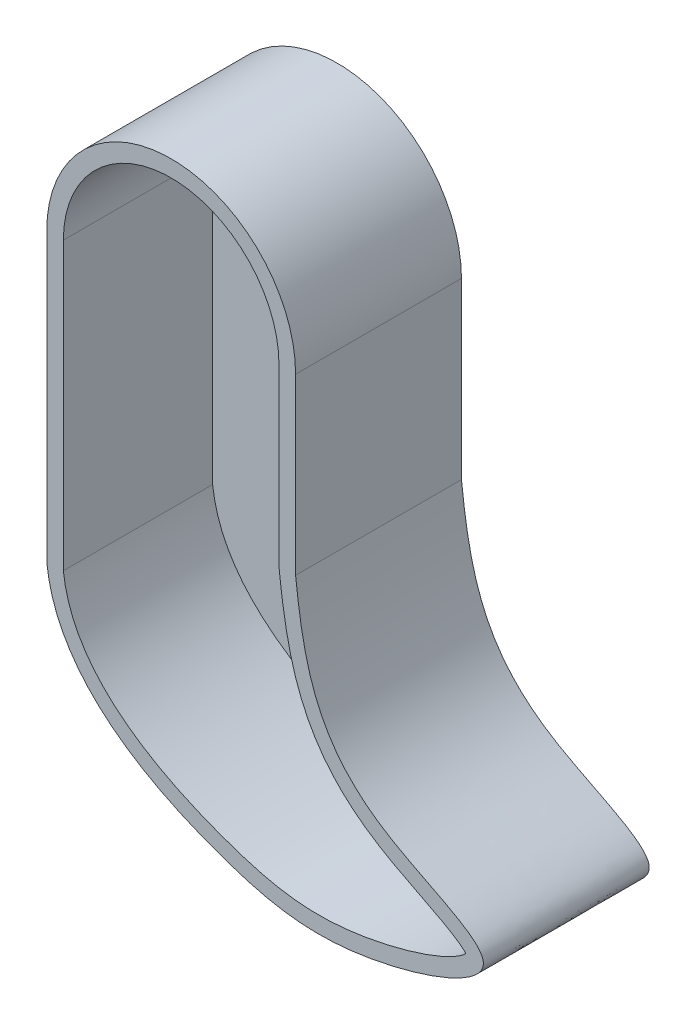
ISO-10303-21;
HEADER;
FILE_DESCRIPTION(('STEP AP214'),'2;1');
FILE_NAME('part.step','',(''),(''),'','','');
FILE_SCHEMA(('AUTOMOTIVE_DESIGN { 1 0 10303 214 1 1 1 1 }'));
ENDSEC;
DATA;
#1=APPLICATION_CONTEXT('core data for automotive mechanical design processes');
#2=APPLICATION_PROTOCOL_DEFINITION('international standard','automotive_design',2000,#1);
#3=PRODUCT_CONTEXT('',#1,'mechanical');
#4=PRODUCT('Part','Part','',(#3));
#5=PRODUCT_RELATED_PRODUCT_CATEGORY('part','',(#4));
#6=PRODUCT_DEFINITION_FORMATION('','',#4);
#7=PRODUCT_DEFINITION_CONTEXT('part definition',#1,'design');
#8=PRODUCT_DEFINITION('design','',#6,#7);
#9=PRODUCT_DEFINITION_SHAPE('','',#8);
#10=(LENGTH_UNIT() NAMED_UNIT(*) SI_UNIT(.MILLI.,.METRE.));
#11=(NAMED_UNIT(*) PLANE_ANGLE_UNIT() SI_UNIT($,.RADIAN.));
#12=(NAMED_UNIT(*) SI_UNIT($,.STERADIAN.) SOLID_ANGLE_UNIT());
#13=UNCERTAINTY_MEASURE_WITH_UNIT(LENGTH_MEASURE(1.E-05),#10,'distance_accuracy_value','');
#14=(GEOMETRIC_REPRESENTATION_CONTEXT(3) GLOBAL_UNCERTAINTY_ASSIGNED_CONTEXT((#13)) GLOBAL_UNIT_ASSIGNED_CONTEXT((#10,
#11,#12)) REPRESENTATION_CONTEXT('',''));
#15=CARTESIAN_POINT('',(0.,0.,0.));
#16=DIRECTION('',(0.,0.,1.));
#17=DIRECTION('',(1.,0.,0.));
#18=AXIS2_PLACEMENT_3D('',#15,#16,#17);
#19=CARTESIAN_POINT('',(13.921361338976,-27.838430990596,10.));
#20=DIRECTION('',(0.,0.,-1.));
#21=DIRECTION('',(-1.,0.,0.));
#22=AXIS2_PLACEMENT_3D('',#19,#20,#21);
#23=PLANE('',#22);
#24=CARTESIAN_POINT('',(-7.5,-17.3169089590409,10.));
#25=CARTESIAN_POINT('',(-6.89625884792365,-22.8795869577521,10.));
#26=CARTESIAN_POINT('',(1.36358622441409,-27.3729409812053,10.));
#27=CARTESIAN_POINT('',(10.3404825219533,-29.3226567150593,10.));
#28=CARTESIAN_POINT('',(22.6747988148398,-25.2262217653623,10.));
#29=CARTESIAN_POINT('',(9.30587516399608,-20.560899137592,10.));
#30=CARTESIAN_POINT('',(8.02129707642926,-15.2016571727447,10.));
#31=CARTESIAN_POINT('',(7.5,-10.5047296805398,10.));
#32=B_SPLINE_CURVE_WITH_KNOTS('',3,(#24,#25,#26,#27,#28,#29,#30,#31),.UNSPECIFIED.,.F.,.F.,(4,1,
1,1,1,4),(0.,0.302367305595142,0.458332467384121,0.620571953409648,0.756191840725524,1.),.UNSPECIFIED.);
#33=CARTESIAN_POINT('',(-7.5,-17.3169089590409,10.));
#34=VERTEX_POINT('',#33);
#35=CARTESIAN_POINT('',(7.5,-10.5047296805398,10.));
#36=VERTEX_POINT('',#35);
#37=EDGE_CURVE('E230',#34,#36,#32,.T.);
#38=ORIENTED_EDGE('',*,*,#37,.T.);
#39=DIRECTION('',(0.,1.,0.));
#40=VECTOR('',#39,1.);
#41=CARTESIAN_POINT('',(7.5,0.,10.));
#42=LINE('',#41,#40);
#43=CARTESIAN_POINT('',(7.5,0.,10.));
#44=VERTEX_POINT('',#43);
#45=EDGE_CURVE('E89',#36,#44,#42,.T.);
#46=ORIENTED_EDGE('',*,*,#45,.T.);
#47=CARTESIAN_POINT('',(0.,0.,10.));
#48=DIRECTION('',(0.,0.,1.));
#49=DIRECTION('',(1.,0.,0.));
#50=AXIS2_PLACEMENT_3D('',#47,#48,#49);
#51=CIRCLE('',#50,7.5);
#52=CARTESIAN_POINT('',(-7.5,0.,10.));
#53=VERTEX_POINT('',#52);
#54=EDGE_CURVE('E226',#44,#53,#51,.T.);
#55=ORIENTED_EDGE('',*,*,#54,.T.);
#56=DIRECTION('',(0.,-1.,0.));
#57=VECTOR('',#56,1.);
#58=CARTESIAN_POINT('',(-7.5,0.,10.));
#59=LINE('',#58,#57);
#60=EDGE_CURVE('E61',#53,#34,#59,.T.);
#61=ORIENTED_EDGE('',*,*,#60,.T.);
#62=EDGE_LOOP('',(#38,#46,#55,#61));
#63=FACE_BOUND('',#62,.T.);
#64=CARTESIAN_POINT('',(-6.49999999999993,-17.261239945099,9.99999999999999));
#65=CARTESIAN_POINT('',(-6.48029906016181,-17.4328165468344,10.));
#66=CARTESIAN_POINT('',(-6.45509323324352,-17.6037808591576,10.));
#67=CARTESIAN_POINT('',(-6.39355463378053,-17.9436223656716,10.));
#68=CARTESIAN_POINT('',(-6.35722625396409,-18.1125003564876,10.));
#69=CARTESIAN_POINT('',(-6.27331995548039,-18.4474037011993,10.));
#70=CARTESIAN_POINT('',(-6.22574469781171,-18.6134297199166,10.));
#71=CARTESIAN_POINT('',(-6.12013460749391,-18.9398851210933,10.));
#72=CARTESIAN_POINT('',(-6.06223422575287,-19.1003580396069,10.));
#73=CARTESIAN_POINT('',(-5.93592880304156,-19.4171121801897,10.));
#74=CARTESIAN_POINT('',(-5.86752391746992,-19.5733934642278,10.));
#75=CARTESIAN_POINT('',(-5.72074424757256,-19.8811661946707,10.));
#76=CARTESIAN_POINT('',(-5.6423702788494,-20.0326580316511,10.));
#77=CARTESIAN_POINT('',(-5.43500746583914,-20.4044361187385,10.));
#78=CARTESIAN_POINT('',(-5.30021693932986,-20.621508827345,10.));
#79=CARTESIAN_POINT('',(-5.01226569773036,-21.0430348770489,10.));
#80=CARTESIAN_POINT('',(-4.85910295241641,-21.2474868196993,10.));
#81=CARTESIAN_POINT('',(-4.53680312190699,-21.6438328646214,10.));
#82=CARTESIAN_POINT('',(-4.36764281904924,-21.8357080088182,10.));
#83=CARTESIAN_POINT('',(-4.01603093713922,-22.2067951451904,10.));
#84=CARTESIAN_POINT('',(-3.83357855950455,-22.3860063752468,10.));
#85=CARTESIAN_POINT('',(-3.33789964982451,-22.8425598375109,10.));
#86=CARTESIAN_POINT('',(-3.01533202203772,-23.1097847080785,10.));
#87=CARTESIAN_POINT('',(-2.34815144859963,-23.6151887548566,10.));
#88=CARTESIAN_POINT('',(-2.00352181788423,-23.8533455421908,10.));
#89=CARTESIAN_POINT('',(-1.2956404040035,-24.3054911038546,10.));
#90=CARTESIAN_POINT('',(-0.932279679330191,-24.5193079575086,10.));
#91=CARTESIAN_POINT('',(-0.1931361983791,-24.9242762146099,10.));
#92=CARTESIAN_POINT('',(0.182649137410054,-25.1154228731613,9.99999999999999));
#93=CARTESIAN_POINT('',(0.812572312512014,-25.4154727327877,9.99999999999999));
#94=CARTESIAN_POINT('',(1.0640478406448,-25.5300337102047,10.));
#95=CARTESIAN_POINT('',(1.57044344627079,-25.7513613484301,10.));
#96=CARTESIAN_POINT('',(1.82536395351148,-25.8581270259684,10.));
#97=CARTESIAN_POINT('',(2.33825409101171,-26.0645619215595,10.));
#98=CARTESIAN_POINT('',(2.59622567150063,-26.1642262788482,10.));
#99=CARTESIAN_POINT('',(3.11486458162769,-26.3570747331266,10.));
#100=CARTESIAN_POINT('',(3.37553435177269,-26.4502522418269,10.));
#101=CARTESIAN_POINT('',(3.89678670150565,-26.629768500074,10.));
#102=CARTESIAN_POINT('',(4.15735171494059,-26.7161580045258,10.));
#103=CARTESIAN_POINT('',(4.68116014836606,-26.8799427220831,10.));
#104=CARTESIAN_POINT('',(4.94440183629279,-26.9573433933567,10.));
#105=CARTESIAN_POINT('',(5.47379131233374,-27.1001119481251,10.));
#106=CARTESIAN_POINT('',(5.73993476563539,-27.1654957115978,10.));
#107=CARTESIAN_POINT('',(6.27524416947605,-27.2816449185962,10.));
#108=CARTESIAN_POINT('',(6.54440773753797,-27.3324211442526,9.99999999999999));
#109=CARTESIAN_POINT('',(6.97071358182693,-27.3995689623728,10.));
#110=CARTESIAN_POINT('',(7.1270091833725,-27.4214031515299,10.));
#111=CARTESIAN_POINT('',(7.44028704548098,-27.4594791317654,10.));
#112=CARTESIAN_POINT('',(7.59726931480795,-27.4757208512541,10.));
#113=CARTESIAN_POINT('',(7.91187884802593,-27.5025699601194,10.));
#114=CARTESIAN_POINT('',(8.06950661195826,-27.5131714893043,10.));
#115=CARTESIAN_POINT('',(8.38504206045178,-27.5287914062703,10.));
#116=CARTESIAN_POINT('',(8.54294976216256,-27.5338094392597,10.));
#117=CARTESIAN_POINT('',(9.01681640956228,-27.5407237637606,10.));
#118=CARTESIAN_POINT('',(9.33291986202077,-27.5344803612462,10.));
#119=CARTESIAN_POINT('',(9.96474927181373,-27.5024279032612,10.));
#120=CARTESIAN_POINT('',(10.2804729474075,-27.4765767100368,10.));
#121=CARTESIAN_POINT('',(10.7525955002393,-27.425104892758,10.));
#122=CARTESIAN_POINT('',(10.9097210604433,-27.4058325682766,10.));
#123=CARTESIAN_POINT('',(11.2234481057773,-27.363388017639,10.));
#124=CARTESIAN_POINT('',(11.3800495864079,-27.3402157580862,10.));
#125=CARTESIAN_POINT('',(11.6926798783897,-27.2903839648362,10.));
#126=CARTESIAN_POINT('',(11.8487087356949,-27.2637247175566,10.));
#127=CARTESIAN_POINT('',(12.1601744067584,-27.2071663238503,10.));
#128=CARTESIAN_POINT('',(12.3156112255831,-27.1772672052133,10.));
#129=CARTESIAN_POINT('',(12.7265477001599,-27.0939736197893,10.));
#130=CARTESIAN_POINT('',(12.9815135004647,-27.0379248873304,10.));
#131=CARTESIAN_POINT('',(13.4894426852966,-26.9176125746787,10.));
#132=CARTESIAN_POINT('',(13.7424064702328,-26.8533506836141,10.));
#133=CARTESIAN_POINT('',(14.2464145360765,-26.7160641566162,10.));
#134=CARTESIAN_POINT('',(14.4974548116646,-26.6430247756349,10.));
#135=CARTESIAN_POINT('',(14.996507755685,-26.4872153794536,10.));
#136=CARTESIAN_POINT('',(15.2445207375963,-26.4044463813638,10.));
#137=CARTESIAN_POINT('',(15.632509641243,-26.2644525437871,10.));
#138=CARTESIAN_POINT('',(15.7739155900815,-26.2111854834667,10.));
#139=CARTESIAN_POINT('',(16.0548690037753,-26.0999729344172,10.));
#140=CARTESIAN_POINT('',(16.1944167543763,-26.0420281749131,10.));
#141=CARTESIAN_POINT('',(16.4243011138092,-25.9409252224867,10.));
#142=CARTESIAN_POINT('',(16.515345969151,-25.8993796199356,10.));
#143=CARTESIAN_POINT('',(16.6960081145704,-25.8132947594487,10.));
#144=CARTESIAN_POINT('',(16.7856254969678,-25.7687556960909,10.));
#145=CARTESIAN_POINT('',(16.9629814464259,-25.6760081265155,10.));
#146=CARTESIAN_POINT('',(17.0507197831614,-25.6277991737201,10.));
#147=CARTESIAN_POINT('',(17.1746030470854,-25.5552407521348,10.));
#148=CARTESIAN_POINT('',(17.2118741103908,-25.5328103949705,10.));
#149=CARTESIAN_POINT('',(17.2857603620924,-25.486927613043,10.));
#150=CARTESIAN_POINT('',(17.3223758530832,-25.4634756779203,10.));
#151=CARTESIAN_POINT('',(17.3947735465507,-25.4153956751291,10.));
#152=CARTESIAN_POINT('',(17.4305565777302,-25.3907688587321,10.));
#153=CARTESIAN_POINT('',(17.5013553411414,-25.3398954622947,10.));
#154=CARTESIAN_POINT('',(17.5363636803619,-25.3136384833334,10.));
#155=CARTESIAN_POINT('',(17.5878101164617,-25.2728748754743,10.));
#156=CARTESIAN_POINT('',(17.6047890691941,-25.2590504145316,10.));
#157=CARTESIAN_POINT('',(17.638300369847,-25.2308766124184,10.));
#158=CARTESIAN_POINT('',(17.654832818426,-25.2165273912947,10.));
#159=CARTESIAN_POINT('',(17.6874255292288,-25.1871486071416,10.));
#160=CARTESIAN_POINT('',(17.7034832737142,-25.1721162218114,10.));
#161=CARTESIAN_POINT('',(17.734845672944,-25.1412646107769,10.));
#162=CARTESIAN_POINT('',(17.7501497329763,-25.125444782904,10.));
#163=CARTESIAN_POINT('',(17.7649636355238,-25.1091586426348,10.));
#164=B_SPLINE_CURVE_WITH_KNOTS('',3,(#64,#65,#66,#67,#68,#69,#70,#71,#72,#73,#74,#75,#76,#77,
#78,#79,#80,#81,#82,#83,#84,#85,#86,#87,#88,#89,#90,#91,#92,#93,#94,#95,#96,#97,#98,#99,#100,
#101,#102,#103,#104,#105,#106,#107,#108,#109,#110,#111,#112,#113,#114,#115,#116,#117,#118,#119,
#120,#121,#122,#123,#124,#125,#126,#127,#128,#129,#130,#131,#132,#133,#134,#135,#136,#137,#138,
#139,#140,#141,#142,#143,#144,#145,#146,#147,#148,#149,#150,#151,#152,#153,#154,#155,#156,#157,
#158,#159,#160,#161,#162,#163),.UNSPECIFIED.,.F.,.F.,(4,2,2,2,2,2,2,2,2,2,2,2,2,2,2,2,2,2,2,2,2,
2,2,2,2,2,2,2,2,2,2,2,2,2,2,2,2,2,2,2,2,2,2,2,2,2,2,2,2,4),(0.,0.518053182814718,
1.0359020296474,1.55362847643608,2.06504922092012,2.57646240041711,3.08783376644617,
3.85325986621461,4.61877062752203,5.385409961692,6.15209539328386,7.40661975249448,
8.66210435665975,9.92596876800315,11.1900972424152,12.0189953660128,12.8479978637752,
13.6775624579954,14.5079576556418,15.3313958035025,16.1543313024597,16.9761713728533,
17.7974032601956,18.2707542308085,18.7441112606013,19.2179591554148,19.6918371581948,
20.639590266651,21.5893859172373,22.0642546107012,22.5391273708247,23.0139611498217,
23.4887908562769,24.2718060199006,25.0546604060172,25.8388487689217,26.6229552275033,
27.0762115891065,27.5293974267347,27.8295811501585,28.1297453801688,28.4299461948366,
28.560433421239,28.6908587790743,28.8211482040758,28.9523770805086,29.0180540067527,
29.0837160012647,29.149679604839,29.2156944508237),.UNSPECIFIED.);
#165=CARTESIAN_POINT('',(-6.49999999999993,-17.261239945099,9.99999999999999));
#166=VERTEX_POINT('',#165);
#167=CARTESIAN_POINT('',(17.7649636355238,-25.1091586426349,10.));
#168=VERTEX_POINT('',#167);
#169=EDGE_CURVE('E164',#166,#168,#164,.T.);
#170=ORIENTED_EDGE('',*,*,#169,.F.);
#171=DIRECTION('',(0.,-1.,0.));
#172=VECTOR('',#171,1.);
#173=CARTESIAN_POINT('',(-6.5,-27.838430990596,10.));
#174=LINE('',#173,#172);
#175=CARTESIAN_POINT('',(-6.5,0.,10.));
#176=VERTEX_POINT('',#175);
#177=EDGE_CURVE('E130',#176,#166,#174,.T.);
#178=ORIENTED_EDGE('',*,*,#177,.F.);
#179=CARTESIAN_POINT('',(0.,0.,10.));
#180=DIRECTION('',(0.,0.,-1.));
#181=DIRECTION('',(-1.,0.,0.));
#182=AXIS2_PLACEMENT_3D('',#179,#180,#181);
#183=CIRCLE('',#182,6.5);
#184=CARTESIAN_POINT('',(6.5,0.,10.));
#185=VERTEX_POINT('',#184);
#186=EDGE_CURVE('E279',#185,#176,#183,.F.);
#187=ORIENTED_EDGE('',*,*,#186,.F.);
#188=DIRECTION('',(0.,1.,0.));
#189=VECTOR('',#188,1.);
#190=CARTESIAN_POINT('',(6.5,-27.838430990596,10.));
#191=LINE('',#190,#189);
#192=CARTESIAN_POINT('',(6.5,-10.5600532452522,10.));
#193=VERTEX_POINT('',#192);
#194=EDGE_CURVE('E170',#193,#185,#191,.T.);
#195=ORIENTED_EDGE('',*,*,#194,.F.);
#196=CARTESIAN_POINT('',(17.7649636355238,-25.1091586426349,10.));
#197=CARTESIAN_POINT('',(17.7505571625753,-25.0932423332572,10.));
#198=CARTESIAN_POINT('',(17.7357350873014,-25.0777172368619,10.));
#199=CARTESIAN_POINT('',(17.7054486632689,-25.0473227262312,10.));
#200=CARTESIAN_POINT('',(17.6899847000054,-25.0324529292008,10.));
#201=CARTESIAN_POINT('',(17.6586106157325,-25.0032467132118,10.));
#202=CARTESIAN_POINT('',(17.6427012340435,-24.9889094927786,10.));
#203=CARTESIAN_POINT('',(17.6105009424539,-24.9606653835675,10.));
#204=CARTESIAN_POINT('',(17.5942099667619,-24.9467585699708,10.));
#205=CARTESIAN_POINT('',(17.5449855412641,-24.9056833929883,10.));
#206=CARTESIAN_POINT('',(17.5115944952163,-24.8790633871287,10.));
#207=CARTESIAN_POINT('',(17.4439260774812,-24.8269515424653,10.));
#208=CARTESIAN_POINT('',(17.4096482913261,-24.8014602468925,10.));
#209=CARTESIAN_POINT('',(17.3408762372526,-24.7517260688844,10.));
#210=CARTESIAN_POINT('',(17.3063905610546,-24.7274712733044,10.));
#211=CARTESIAN_POINT('',(17.2369126422226,-24.6797146428677,10.));
#212=CARTESIAN_POINT('',(17.2019204903128,-24.6562126755231,10.));
#213=CARTESIAN_POINT('',(17.0962563386349,-24.5866036223037,10.));
#214=CARTESIAN_POINT('',(17.0249626364255,-24.5414403175776,10.));
#215=CARTESIAN_POINT('',(16.8814165835917,-24.4530756764949,10.));
#216=CARTESIAN_POINT('',(16.8091669558068,-24.4098698762294,10.));
#217=CARTESIAN_POINT('',(16.6638729542519,-24.3248780452416,10.));
#218=CARTESIAN_POINT('',(16.5908288619411,-24.2830915320268,10.));
#219=CARTESIAN_POINT('',(16.4441510353493,-24.2006056135248,10.));
#220=CARTESIAN_POINT('',(16.3705174235692,-24.1599059896333,10.));
#221=CARTESIAN_POINT('',(16.2227911573293,-24.0793335427676,10.));
#222=CARTESIAN_POINT('',(16.1486984598887,-24.0394607987748,10.));
#223=CARTESIAN_POINT('',(15.9259270474417,-23.9207828299126,10.));
#224=CARTESIAN_POINT('',(15.7767499768321,-23.842915075834,10.));
#225=CARTESIAN_POINT('',(15.4718789072206,-23.6854215506577,10.));
#226=CARTESIAN_POINT('',(15.3161588480723,-23.6058466643147,10.));
#227=CARTESIAN_POINT('',(15.0044580782047,-23.4469874191277,10.));
#228=CARTESIAN_POINT('',(14.8484772690663,-23.3677032537844,10.));
#229=CARTESIAN_POINT('',(14.5367292262241,-23.2085549746796,10.));
#230=CARTESIAN_POINT('',(14.3809621075205,-23.1286906346406,10.));
#231=CARTESIAN_POINT('',(14.0700862527273,-22.9675686687204,10.));
#232=CARTESIAN_POINT('',(13.9149777358256,-22.886310618382,10.));
#233=CARTESIAN_POINT('',(13.6058699220181,-22.7215693342841,10.));
#234=CARTESIAN_POINT('',(13.4518710334286,-22.638085329727,10.));
#235=CARTESIAN_POINT('',(13.2045474998594,-22.5007617041083,10.));
#236=CARTESIAN_POINT('',(13.1106896503221,-22.4478833485505,10.));
#237=CARTESIAN_POINT('',(12.9237756639142,-22.3407257434688,10.));
#238=CARTESIAN_POINT('',(12.8307195248488,-22.2864464977814,10.));
#239=CARTESIAN_POINT('',(12.645595128581,-22.176234808131,10.));
#240=CARTESIAN_POINT('',(12.5535268222113,-22.1203024469735,10.));
#241=CARTESIAN_POINT('',(12.3705880926179,-22.0065102884524,10.));
#242=CARTESIAN_POINT('',(12.2797176642472,-21.9486504993747,10.));
#243=CARTESIAN_POINT('',(12.0992993753896,-21.8309675631804,10.));
#244=CARTESIAN_POINT('',(12.0097510782925,-21.7711450862314,10.));
#245=CARTESIAN_POINT('',(11.8320533220089,-21.6494593967372,10.));
#246=CARTESIAN_POINT('',(11.743903874323,-21.5875961674268,10.));
#247=CARTESIAN_POINT('',(11.4816869223924,-21.3988405591983,10.));
#248=CARTESIAN_POINT('',(11.3098684802247,-21.2687937364546,10.));
#249=CARTESIAN_POINT('',(10.9769188210014,-21.0029277720903,10.));
#250=CARTESIAN_POINT('',(10.8156354450643,-20.8672993026084,10.));
#251=CARTESIAN_POINT('',(10.5005820813295,-20.5874281364921,10.));
#252=CARTESIAN_POINT('',(10.3468152913358,-20.4431818305492,10.));
#253=CARTESIAN_POINT('',(10.0478140502741,-20.1461379023526,10.));
#254=CARTESIAN_POINT('',(9.90257807873936,-19.9933418134832,10.));
#255=CARTESIAN_POINT('',(9.62150621538568,-19.6794226865007,10.));
#256=CARTESIAN_POINT('',(9.48566722168205,-19.5183024271193,10.));
#257=CARTESIAN_POINT('',(9.20342238093093,-19.1620518328644,10.));
#258=CARTESIAN_POINT('',(9.05872500782777,-18.9655633107356,10.));
#259=CARTESIAN_POINT('',(8.78357290760833,-18.562865609258,10.));
#260=CARTESIAN_POINT('',(8.65311826090011,-18.3566563750398,10.));
#261=CARTESIAN_POINT('',(8.40674627185208,-17.9357933836112,10.));
#262=CARTESIAN_POINT('',(8.2908264049602,-17.7211411014097,10.));
#263=CARTESIAN_POINT('',(8.07117158469306,-17.2805470241438,10.));
#264=CARTESIAN_POINT('',(7.96771380019996,-17.0544675110704,10.));
#265=CARTESIAN_POINT('',(7.77486005168547,-16.5963816948951,10.));
#266=CARTESIAN_POINT('',(7.68546615160262,-16.3643745276797,10.));
#267=CARTESIAN_POINT('',(7.51959853235106,-15.8958340095877,10.));
#268=CARTESIAN_POINT('',(7.44312414929945,-15.6593008919776,10.));
#269=CARTESIAN_POINT('',(7.2928242257589,-15.1530991609168,10.));
#270=CARTESIAN_POINT('',(7.22052201586254,-14.8829812335082,10.));
#271=CARTESIAN_POINT('',(7.08821588698118,-14.3397570932647,10.));
#272=CARTESIAN_POINT('',(7.02821351173458,-14.0666505098526,10.));
#273=CARTESIAN_POINT('',(6.91823677554613,-13.5182752526109,10.));
#274=CARTESIAN_POINT('',(6.8682687191229,-13.2430053317119,10.));
#275=CARTESIAN_POINT('',(6.77784655500824,-12.7005515313273,10.));
#276=CARTESIAN_POINT('',(6.73712653493331,-12.4334112886218,10.));
#277=CARTESIAN_POINT('',(6.66137038959387,-11.8985479604055,10.));
#278=CARTESIAN_POINT('',(6.62632996168699,-11.6308254732819,10.));
#279=CARTESIAN_POINT('',(6.56043645469034,-11.0954581898135,10.));
#280=CARTESIAN_POINT('',(6.52957435433921,-10.82781451252,10.));
#281=CARTESIAN_POINT('',(6.5,-10.5600532452522,10.));
#282=B_SPLINE_CURVE_WITH_KNOTS('',3,(#196,#197,#198,#199,#200,#201,#202,#203,#204,#205,#206,
#207,#208,#209,#210,#211,#212,#213,#214,#215,#216,#217,#218,#219,#220,#221,#222,#223,#224,#225,
#226,#227,#228,#229,#230,#231,#232,#233,#234,#235,#236,#237,#238,#239,#240,#241,#242,#243,#244,
#245,#246,#247,#248,#249,#250,#251,#252,#253,#254,#255,#256,#257,#258,#259,#260,#261,#262,#263,
#264,#265,#266,#267,#268,#269,#270,#271,#272,#273,#274,#275,#276,#277,#278,#279,#280,#281),
.UNSPECIFIED.,.F.,.F.,(4,2,2,2,2,2,2,2,2,2,2,2,2,2,2,2,2,2,2,2,2,2,2,2,2,2,2,2,2,2,2,2,2,2,2,2,
2,2,2,2,2,2,4),(0.,0.064380397903796,0.128722675323716,0.192963839686072,0.257216162750754,
0.385290176805529,0.513425175419209,0.639896211443687,0.766344866545101,1.01948495800767,
1.27201528979187,1.52445889565396,1.77685133960361,2.02926778136988,2.53408339403622,
3.05870452889372,3.58362751038899,4.10876757320321,4.63407051293037,5.15955777809261,
5.48273340838623,5.80590815369995,6.12906673835665,6.45222393397713,6.77527191177183,
7.09832254414471,7.74448695859619,8.37639427296369,9.00856812271031,9.64062895466048,
10.2724801416901,11.0039086013567,11.7353411901267,12.4666465595558,13.2120143446999,
13.9574914141003,14.7029301647218,15.541456702602,16.3800884186554,17.2192454060454,
18.0298434429912,18.839824502333,19.648027882908),.UNSPECIFIED.);
#283=EDGE_CURVE('E124',#168,#193,#282,.T.);
#284=ORIENTED_EDGE('',*,*,#283,.F.);
#285=EDGE_LOOP('',(#170,#178,#187,#195,#284));
#286=FACE_BOUND('',#285,.T.);
#287=ADVANCED_FACE('F35',(#63,#286),#23,.F.);
#288=DIRECTION('',(0.,0.,-1.));
#289=VECTOR('',#288,1.);
#290=SURFACE_OF_LINEAR_EXTRUSION('',#32,#289);
#291=CARTESIAN_POINT('',(-7.5,-17.3169089590409,0.));
#292=CARTESIAN_POINT('',(-6.89625884792365,-22.8795869577521,0.));
#293=CARTESIAN_POINT('',(1.36358622441409,-27.3729409812053,0.));
#294=CARTESIAN_POINT('',(10.3404825219533,-29.3226567150593,0.));
#295=CARTESIAN_POINT('',(22.6747988148398,-25.2262217653623,0.));
#296=CARTESIAN_POINT('',(9.30587516399608,-20.560899137592,0.));
#297=CARTESIAN_POINT('',(8.02129707642926,-15.2016571727447,0.));
#298=CARTESIAN_POINT('',(7.5,-10.5047296805398,0.));
#299=B_SPLINE_CURVE_WITH_KNOTS('',3,(#291,#292,#293,#294,#295,#296,#297,#298),.UNSPECIFIED.,.F.,
.F.,(4,1,1,1,1,4),(0.,0.302367305595142,0.458332467384121,0.620571953409648,0.756191840725524,
1.),.UNSPECIFIED.);
#300=CARTESIAN_POINT('',(-7.5,-17.3169089590409,0.));
#301=VERTEX_POINT('',#300);
#302=CARTESIAN_POINT('',(7.5,-10.5047296805398,0.));
#303=VERTEX_POINT('',#302);
#304=EDGE_CURVE('E223',#301,#303,#299,.T.);
#305=ORIENTED_EDGE('',*,*,#304,.T.);
#306=DIRECTION('',(0.,0.,-1.));
#307=VECTOR('',#306,1.);
#308=CARTESIAN_POINT('',(7.5,-10.5047296805398,10.));
#309=LINE('',#308,#307);
#310=EDGE_CURVE('E11',#36,#303,#309,.T.);
#311=ORIENTED_EDGE('',*,*,#310,.F.);
#312=ORIENTED_EDGE('',*,*,#37,.F.);
#313=DIRECTION('',(0.,0.,-1.));
#314=VECTOR('',#313,1.);
#315=CARTESIAN_POINT('',(-7.5,-17.3169089590409,10.));
#316=LINE('',#315,#314);
#317=EDGE_CURVE('E234',#34,#301,#316,.T.);
#318=ORIENTED_EDGE('',*,*,#317,.T.);
#319=EDGE_LOOP('',(#305,#311,#312,#318));
#320=FACE_BOUND('',#319,.T.);
#321=ADVANCED_FACE('F37',(#320),#290,.F.);
#322=CARTESIAN_POINT('',(7.5,0.,10.));
#323=DIRECTION('',(-1.,0.,0.));
#324=DIRECTION('',(0.,0.,1.));
#325=AXIS2_PLACEMENT_3D('',#322,#323,#324);
#326=PLANE('',#325);
#327=DIRECTION('',(0.,1.,0.));
#328=VECTOR('',#327,1.);
#329=CARTESIAN_POINT('',(7.5,0.,0.));
#330=LINE('',#329,#328);
#331=CARTESIAN_POINT('',(7.5,0.,0.));
#332=VERTEX_POINT('',#331);
#333=EDGE_CURVE('E214',#303,#332,#330,.T.);
#334=ORIENTED_EDGE('',*,*,#333,.T.);
#335=DIRECTION('',(0.,0.,-1.));
#336=VECTOR('',#335,1.);
#337=CARTESIAN_POINT('',(7.5,0.,10.));
#338=LINE('',#337,#336);
#339=EDGE_CURVE('E45',#44,#332,#338,.T.);
#340=ORIENTED_EDGE('',*,*,#339,.F.);
#341=ORIENTED_EDGE('',*,*,#45,.F.);
#342=ORIENTED_EDGE('',*,*,#310,.T.);
#343=EDGE_LOOP('',(#334,#340,#341,#342));
#344=FACE_BOUND('',#343,.T.);
#345=ADVANCED_FACE('F195',(#344),#326,.F.);
#346=CARTESIAN_POINT('',(0.,0.,10.));
#347=DIRECTION('',(0.,0.,-1.));
#348=DIRECTION('',(-1.,0.,0.));
#349=AXIS2_PLACEMENT_3D('',#346,#347,#348);
#350=CYLINDRICAL_SURFACE('',#349,7.5);
#351=CARTESIAN_POINT('',(0.,0.,0.));
#352=DIRECTION('',(0.,0.,1.));
#353=DIRECTION('',(1.,0.,0.));
#354=AXIS2_PLACEMENT_3D('',#351,#352,#353);
#355=CIRCLE('',#354,7.5);
#356=CARTESIAN_POINT('',(-7.5,0.,0.));
#357=VERTEX_POINT('',#356);
#358=EDGE_CURVE('E222',#332,#357,#355,.T.);
#359=ORIENTED_EDGE('',*,*,#358,.T.);
#360=DIRECTION('',(0.,0.,-1.));
#361=VECTOR('',#360,1.);
#362=CARTESIAN_POINT('',(-7.5,0.,10.));
#363=LINE('',#362,#361);
#364=EDGE_CURVE('E227',#53,#357,#363,.T.);
#365=ORIENTED_EDGE('',*,*,#364,.F.);
#366=ORIENTED_EDGE('',*,*,#54,.F.);
#367=ORIENTED_EDGE('',*,*,#339,.T.);
#368=EDGE_LOOP('',(#359,#365,#366,#367));
#369=FACE_BOUND('',#368,.T.);
#370=ADVANCED_FACE('F208',(#369),#350,.T.);
#371=CARTESIAN_POINT('',(-7.5,0.,10.));
#372=DIRECTION('',(1.,0.,0.));
#373=DIRECTION('',(0.,0.,-1.));
#374=AXIS2_PLACEMENT_3D('',#371,#372,#373);
#375=PLANE('',#374);
#376=DIRECTION('',(0.,-1.,0.));
#377=VECTOR('',#376,1.);
#378=CARTESIAN_POINT('',(-7.5,0.,0.));
#379=LINE('',#378,#377);
#380=EDGE_CURVE('E82',#357,#301,#379,.T.);
#381=ORIENTED_EDGE('',*,*,#380,.T.);
#382=ORIENTED_EDGE('',*,*,#317,.F.);
#383=ORIENTED_EDGE('',*,*,#60,.F.);
#384=ORIENTED_EDGE('',*,*,#364,.T.);
#385=EDGE_LOOP('',(#381,#382,#383,#384));
#386=FACE_BOUND('',#385,.T.);
#387=ADVANCED_FACE('F204',(#386),#375,.F.);
#388=CARTESIAN_POINT('',(13.921361338976,-27.838430990596,0.));
#389=DIRECTION('',(0.,0.,-1.));
#390=DIRECTION('',(-1.,0.,0.));
#391=AXIS2_PLACEMENT_3D('',#388,#389,#390);
#392=PLANE('',#391);
#393=CARTESIAN_POINT('',(0.,0.,0.));
#394=DIRECTION('',(0.,0.,-1.));
#395=DIRECTION('',(-1.,0.,0.));
#396=AXIS2_PLACEMENT_3D('',#393,#394,#395);
#397=CIRCLE('',#396,2.5);
#398=CARTESIAN_POINT('',(-2.5,0.,0.));
#399=VERTEX_POINT('',#398);
#400=EDGE_CURVE('E251',#399,#399,#397,.T.);
#401=ORIENTED_EDGE('',*,*,#400,.F.);
#402=EDGE_LOOP('',(#401));
#403=FACE_BOUND('',#402,.T.);
#404=ORIENTED_EDGE('',*,*,#304,.F.);
#405=ORIENTED_EDGE('',*,*,#380,.F.);
#406=ORIENTED_EDGE('',*,*,#358,.F.);
#407=ORIENTED_EDGE('',*,*,#333,.F.);
#408=EDGE_LOOP('',(#404,#405,#406,#407));
#409=FACE_BOUND('',#408,.T.);
#410=ADVANCED_FACE('F201',(#403,#409),#392,.T.);
#411=CARTESIAN_POINT('',(18.7393882410277,-24.7720339527936,10.));
#412=CARTESIAN_POINT('',(18.2068738715191,-23.6639841878111,10.));
#413=CARTESIAN_POINT('',(9.27372566587788,-20.426771877341,10.));
#414=CARTESIAN_POINT('',(8.02129707642926,-15.2016571727447,10.));
#415=CARTESIAN_POINT('',(7.49209031939518,-10.4334628387193,10.));
#416=CARTESIAN_POINT('',(7.48418063879035,-10.3621959968989,10.));
#417=CARTESIAN_POINT('',(7.47627095818552,-10.2909291550784,10.));
#418=B_SPLINE_CURVE_WITH_KNOTS('',3,(#411,#412,#413,#414,#415,#416,#417),.UNSPECIFIED.,.F.,.F.,
(4,1,2,4),(0.630068006150946,0.756191840725524,1.,1.00369931993849),.UNSPECIFIED.);
#419=DIRECTION('',(0.,0.,-1.));
#420=VECTOR('',#419,1.);
#421=SURFACE_OF_LINEAR_EXTRUSION('',#418,#420);
#422=OFFSET_SURFACE('',#421,1.,.F.);
#423=DIRECTION('',(0.,0.,-1.));
#424=VECTOR('',#423,1.);
#425=CARTESIAN_POINT('',(17.7649636355238,-25.1091586426349,1.));
#426=LINE('',#425,#424);
#427=CARTESIAN_POINT('',(17.7649636355237,-25.1091586426349,1.));
#428=VERTEX_POINT('',#427);
#429=EDGE_CURVE('E137',#428,#168,#426,.F.);
#430=ORIENTED_EDGE('',*,*,#429,.T.);
#431=ORIENTED_EDGE('',*,*,#283,.T.);
#432=DIRECTION('',(0.,0.,-1.));
#433=VECTOR('',#432,1.);
#434=CARTESIAN_POINT('',(6.5,-10.5600532452522,10.));
#435=LINE('',#434,#433);
#436=CARTESIAN_POINT('',(6.5,-10.5600532452522,0.999999999999999));
#437=VERTEX_POINT('',#436);
#438=EDGE_CURVE('E245',#193,#437,#435,.T.);
#439=ORIENTED_EDGE('',*,*,#438,.T.);
#440=CARTESIAN_POINT('',(17.7649636355238,-25.1091586426348,1.));
#441=CARTESIAN_POINT('',(17.7505571625753,-25.0932423332572,1.));
#442=CARTESIAN_POINT('',(17.7357350873014,-25.0777172368619,1.));
#443=CARTESIAN_POINT('',(17.7054486632689,-25.0473227262312,1.));
#444=CARTESIAN_POINT('',(17.6899847000054,-25.0324529292007,1.));
#445=CARTESIAN_POINT('',(17.6586106157324,-25.0032467132118,1.));
#446=CARTESIAN_POINT('',(17.6427012340434,-24.9889094927786,1.));
#447=CARTESIAN_POINT('',(17.6105009424539,-24.9606653835674,1.));
#448=CARTESIAN_POINT('',(17.5942099667619,-24.9467585699708,1.));
#449=CARTESIAN_POINT('',(17.5449855412641,-24.9056833929883,1.));
#450=CARTESIAN_POINT('',(17.5115944952163,-24.8790633871287,1.));
#451=CARTESIAN_POINT('',(17.4439260774812,-24.8269515424653,1.));
#452=CARTESIAN_POINT('',(17.4096482913261,-24.8014602468925,1.));
#453=CARTESIAN_POINT('',(17.3408762372525,-24.7517260688844,1.));
#454=CARTESIAN_POINT('',(17.3063905610546,-24.7274712733044,1.));
#455=CARTESIAN_POINT('',(17.2369126422225,-24.6797146428677,1.));
#456=CARTESIAN_POINT('',(17.2019204903128,-24.6562126755231,1.));
#457=CARTESIAN_POINT('',(17.0962563386348,-24.5866036223037,1.));
#458=CARTESIAN_POINT('',(17.0249626364255,-24.5414403175776,1.));
#459=CARTESIAN_POINT('',(16.8814165835917,-24.4530756764949,1.));
#460=CARTESIAN_POINT('',(16.8091669558067,-24.4098698762294,1.));
#461=CARTESIAN_POINT('',(16.6638729542519,-24.3248780452416,1.));
#462=CARTESIAN_POINT('',(16.5908288619411,-24.2830915320268,1.));
#463=CARTESIAN_POINT('',(16.4441510353493,-24.2006056135248,1.));
#464=CARTESIAN_POINT('',(16.3705174235692,-24.1599059896333,1.));
#465=CARTESIAN_POINT('',(16.2227911573293,-24.0793335427676,1.));
#466=CARTESIAN_POINT('',(16.1486984598887,-24.0394607987748,1.));
#467=CARTESIAN_POINT('',(15.9259270474417,-23.9207828299126,1.));
#468=CARTESIAN_POINT('',(15.7767499768321,-23.842915075834,1.));
#469=CARTESIAN_POINT('',(15.4718789072206,-23.6854215506577,1.));
#470=CARTESIAN_POINT('',(15.3161588480723,-23.6058466643147,1.));
#471=CARTESIAN_POINT('',(15.0044580782047,-23.4469874191277,1.));
#472=CARTESIAN_POINT('',(14.8484772690662,-23.3677032537844,1.));
#473=CARTESIAN_POINT('',(14.5367292262241,-23.2085549746796,1.));
#474=CARTESIAN_POINT('',(14.3809621075205,-23.1286906346406,1.));
#475=CARTESIAN_POINT('',(14.0700862527273,-22.9675686687204,1.));
#476=CARTESIAN_POINT('',(13.9149777358256,-22.886310618382,0.999999999999999));
#477=CARTESIAN_POINT('',(13.6058699220181,-22.7215693342841,1.));
#478=CARTESIAN_POINT('',(13.4518710334286,-22.638085329727,1.));
#479=CARTESIAN_POINT('',(13.2045474998594,-22.5007617041083,1.));
#480=CARTESIAN_POINT('',(13.1106896503221,-22.4478833485505,1.));
#481=CARTESIAN_POINT('',(12.9237756639142,-22.3407257434688,1.));
#482=CARTESIAN_POINT('',(12.8307195248488,-22.2864464977814,1.));
#483=CARTESIAN_POINT('',(12.645595128581,-22.176234808131,1.));
#484=CARTESIAN_POINT('',(12.5535268222112,-22.1203024469734,1.));
#485=CARTESIAN_POINT('',(12.3705880926179,-22.0065102884524,1.));
#486=CARTESIAN_POINT('',(12.2797176642471,-21.9486504993746,1.));
#487=CARTESIAN_POINT('',(12.0992993753895,-21.8309675631804,1.));
#488=CARTESIAN_POINT('',(12.0097510782925,-21.7711450862313,1.));
#489=CARTESIAN_POINT('',(11.8320533220088,-21.6494593967372,1.));
#490=CARTESIAN_POINT('',(11.743903874323,-21.5875961674268,1.));
#491=CARTESIAN_POINT('',(11.4816869223923,-21.3988405591982,1.));
#492=CARTESIAN_POINT('',(11.3098684802245,-21.2687937364545,1.));
#493=CARTESIAN_POINT('',(10.9769188210012,-21.0029277720902,1.));
#494=CARTESIAN_POINT('',(10.8156354450641,-20.8672993026083,1.));
#495=CARTESIAN_POINT('',(10.5005820813293,-20.587428136492,1.));
#496=CARTESIAN_POINT('',(10.3468152913357,-20.443181830549,1.));
#497=CARTESIAN_POINT('',(10.047814050274,-20.1461379023524,1.));
#498=CARTESIAN_POINT('',(9.9025780787392,-19.993341813483,1.));
#499=CARTESIAN_POINT('',(9.62150621538551,-19.6794226865005,1.));
#500=CARTESIAN_POINT('',(9.48566722168188,-19.518302427119,0.999999999999998));
#501=CARTESIAN_POINT('',(9.20342238093077,-19.1620518328642,0.999999999999998));
#502=CARTESIAN_POINT('',(9.05872500782761,-18.9655633107354,1.));
#503=CARTESIAN_POINT('',(8.78357290760819,-18.5628656092578,1.));
#504=CARTESIAN_POINT('',(8.65311826089997,-18.3566563750396,1.));
#505=CARTESIAN_POINT('',(8.40674627185195,-17.935793383611,1.));
#506=CARTESIAN_POINT('',(8.29082640496008,-17.7211411014095,1.));
#507=CARTESIAN_POINT('',(8.07117158469295,-17.2805470241435,1.));
#508=CARTESIAN_POINT('',(7.96771380019986,-17.0544675110702,1.));
#509=CARTESIAN_POINT('',(7.77486005168538,-16.5963816948949,1.));
#510=CARTESIAN_POINT('',(7.68546615160253,-16.3643745276795,1.));
#511=CARTESIAN_POINT('',(7.51959853235098,-15.8958340095875,1.));
#512=CARTESIAN_POINT('',(7.44312414929937,-15.6593008919773,0.999999999999998));
#513=CARTESIAN_POINT('',(7.29282422575884,-15.1530991609166,0.999999999999998));
#514=CARTESIAN_POINT('',(7.22052201586249,-14.882981233508,1.));
#515=CARTESIAN_POINT('',(7.08821588698114,-14.3397570932645,1.));
#516=CARTESIAN_POINT('',(7.02821351173455,-14.0666505098524,1.));
#517=CARTESIAN_POINT('',(6.91823677554611,-13.5182752526108,1.));
#518=CARTESIAN_POINT('',(6.86826871912287,-13.2430053317118,1.));
#519=CARTESIAN_POINT('',(6.77784655500823,-12.7005515313272,1.));
#520=CARTESIAN_POINT('',(6.7371265349333,-12.4334112886217,1.));
#521=CARTESIAN_POINT('',(6.66137038959386,-11.8985479604054,1.));
#522=CARTESIAN_POINT('',(6.62632996168699,-11.6308254732818,1.));
#523=CARTESIAN_POINT('',(6.56043645469033,-11.0954581898135,1.));
#524=CARTESIAN_POINT('',(6.5295743543392,-10.82781451252,0.999999999999999));
#525=CARTESIAN_POINT('',(6.5,-10.5600532452522,0.999999999999998));
#526=B_SPLINE_CURVE_WITH_KNOTS('',3,(#440,#441,#442,#443,#444,#445,#446,#447,#448,#449,#450,
#451,#452,#453,#454,#455,#456,#457,#458,#459,#460,#461,#462,#463,#464,#465,#466,#467,#468,#469,
#470,#471,#472,#473,#474,#475,#476,#477,#478,#479,#480,#481,#482,#483,#484,#485,#486,#487,#488,
#489,#490,#491,#492,#493,#494,#495,#496,#497,#498,#499,#500,#501,#502,#503,#504,#505,#506,#507,
#508,#509,#510,#511,#512,#513,#514,#515,#516,#517,#518,#519,#520,#521,#522,#523,#524,#525),
.UNSPECIFIED.,.F.,.F.,(4,2,2,2,2,2,2,2,2,2,2,2,2,2,2,2,2,2,2,2,2,2,2,2,2,2,2,2,2,2,2,2,2,2,2,2,
2,2,2,2,2,2,4),(0.,0.0643803979037935,0.128722675323713,0.192963839686068,0.25721616275075,
0.385290176805522,0.5134251754192,0.639896211443678,0.766344866545092,1.01948495800766,
1.27201528979186,1.52445889565395,1.77685133960359,2.02926778136986,2.53408339403621,
3.0587045288937,3.58362751038897,4.10876757320319,4.63407051293035,5.15955777809258,
5.48273340838622,5.80590815369996,6.12906673835668,6.45222393397717,6.77527191177189,
7.09832254414479,7.74448695859631,8.37639427296384,9.0085681227105,9.6406289546607,
10.2724801416903,11.0039086013569,11.7353411901269,12.466646559556,13.2120143447001,
13.9574914141005,14.702930164722,15.5414567026022,16.3800884186555,17.2192454060455,
18.0298434429912,18.839824502333,19.6480278829079),.UNSPECIFIED.);
#527=EDGE_CURVE('E139',#428,#437,#526,.T.);
#528=ORIENTED_EDGE('',*,*,#527,.F.);
#529=EDGE_LOOP('',(#430,#431,#439,#528));
#530=FACE_BOUND('',#529,.T.);
#531=ADVANCED_FACE('F159',(#530),#422,.T.);
#532=CARTESIAN_POINT('',(-7.5,-17.3169089590409,10.));
#533=CARTESIAN_POINT('',(-6.89625884792365,-22.8795869577521,10.));
#534=CARTESIAN_POINT('',(1.36358622441409,-27.3729409812053,10.));
#535=CARTESIAN_POINT('',(10.1143729167063,-29.2735473747803,10.));
#536=CARTESIAN_POINT('',(18.1489474635751,-26.7232323171946,10.));
#537=CARTESIAN_POINT('',(18.7430061233922,-25.4352866706372,10.));
#538=B_SPLINE_CURVE_WITH_KNOTS('',3,(#532,#533,#534,#535,#536,#537),.UNSPECIFIED.,.F.,.F.,(4,1,
1,4),(0.,0.302367305595142,0.458332467384121,0.604941018756735),.UNSPECIFIED.);
#539=DIRECTION('',(0.,0.,-1.));
#540=VECTOR('',#539,1.);
#541=SURFACE_OF_LINEAR_EXTRUSION('',#538,#540);
#542=OFFSET_SURFACE('',#541,1.,.F.);
#543=ORIENTED_EDGE('',*,*,#429,.F.);
#544=CARTESIAN_POINT('',(-6.49999999999986,-17.261239945099,0.999999999999994));
#545=CARTESIAN_POINT('',(-6.48029906016179,-17.4328165468344,0.999999999999998));
#546=CARTESIAN_POINT('',(-6.45509323324351,-17.6037808591576,0.999999999999999));
#547=CARTESIAN_POINT('',(-6.39355463378053,-17.9436223656716,1.));
#548=CARTESIAN_POINT('',(-6.35722625396409,-18.1125003564876,1.));
#549=CARTESIAN_POINT('',(-6.27331995548038,-18.4474037011993,1.));
#550=CARTESIAN_POINT('',(-6.22574469781171,-18.6134297199167,1.));
#551=CARTESIAN_POINT('',(-6.12013460749391,-18.9398851210933,1.));
#552=CARTESIAN_POINT('',(-6.06223422575287,-19.1003580396069,1.));
#553=CARTESIAN_POINT('',(-5.93592880304155,-19.4171121801897,1.));
#554=CARTESIAN_POINT('',(-5.86752391746992,-19.5733934642278,1.));
#555=CARTESIAN_POINT('',(-5.72074424757256,-19.8811661946707,1.));
#556=CARTESIAN_POINT('',(-5.64237027884939,-20.0326580316511,0.999999999999999));
#557=CARTESIAN_POINT('',(-5.43500746583913,-20.4044361187385,0.999999999999998));
#558=CARTESIAN_POINT('',(-5.30021693932985,-20.621508827345,0.999999999999999));
#559=CARTESIAN_POINT('',(-5.01226569773036,-21.0430348770489,1.));
#560=CARTESIAN_POINT('',(-4.85910295241641,-21.2474868196993,1.));
#561=CARTESIAN_POINT('',(-4.53680312190699,-21.6438328646214,1.));
#562=CARTESIAN_POINT('',(-4.36764281904924,-21.8357080088182,1.));
#563=CARTESIAN_POINT('',(-4.01603093713923,-22.2067951451904,1.));
#564=CARTESIAN_POINT('',(-3.83357855950455,-22.3860063752468,1.));
#565=CARTESIAN_POINT('',(-3.33789964982451,-22.8425598375109,1.));
#566=CARTESIAN_POINT('',(-3.01533202203772,-23.1097847080785,1.));
#567=CARTESIAN_POINT('',(-2.34815144859963,-23.6151887548566,0.999999999999999));
#568=CARTESIAN_POINT('',(-2.00352181788424,-23.8533455421908,1.));
#569=CARTESIAN_POINT('',(-1.29564040400351,-24.3054911038546,1.));
#570=CARTESIAN_POINT('',(-0.932279679330196,-24.5193079575086,1.));
#571=CARTESIAN_POINT('',(-0.193136198379109,-24.9242762146099,0.999999999999999));
#572=CARTESIAN_POINT('',(0.182649137410043,-25.1154228731613,0.999999999999998));
#573=CARTESIAN_POINT('',(0.812572312512005,-25.4154727327877,0.999999999999999));
#574=CARTESIAN_POINT('',(1.0640478406448,-25.5300337102046,1.));
#575=CARTESIAN_POINT('',(1.57044344627079,-25.7513613484301,1.));
#576=CARTESIAN_POINT('',(1.82536395351148,-25.8581270259684,1.));
#577=CARTESIAN_POINT('',(2.33825409101171,-26.0645619215595,1.));
#578=CARTESIAN_POINT('',(2.59622567150063,-26.1642262788482,1.));
#579=CARTESIAN_POINT('',(3.1148645816277,-26.3570747331266,1.));
#580=CARTESIAN_POINT('',(3.3755343517727,-26.4502522418269,1.));
#581=CARTESIAN_POINT('',(3.89678670150566,-26.629768500074,1.));
#582=CARTESIAN_POINT('',(4.1573517149406,-26.7161580045258,1.));
#583=CARTESIAN_POINT('',(4.68116014836608,-26.8799427220831,1.));
#584=CARTESIAN_POINT('',(4.94440183629281,-26.9573433933567,1.));
#585=CARTESIAN_POINT('',(5.47379131233376,-27.1001119481251,1.));
#586=CARTESIAN_POINT('',(5.73993476563542,-27.1654957115978,1.));
#587=CARTESIAN_POINT('',(6.27524416947607,-27.2816449185962,0.999999999999999));
#588=CARTESIAN_POINT('',(6.544407737538,-27.3324211442526,0.999999999999998));
#589=CARTESIAN_POINT('',(6.97071358182696,-27.3995689623728,0.999999999999999));
#590=CARTESIAN_POINT('',(7.12700918337253,-27.4214031515299,1.));
#591=CARTESIAN_POINT('',(7.44028704548102,-27.4594791317654,1.));
#592=CARTESIAN_POINT('',(7.59726931480798,-27.4757208512541,1.));
#593=CARTESIAN_POINT('',(7.91187884802597,-27.5025699601194,1.));
#594=CARTESIAN_POINT('',(8.0695066119583,-27.5131714893043,1.));
#595=CARTESIAN_POINT('',(8.38504206045182,-27.5287914062703,1.));
#596=CARTESIAN_POINT('',(8.54294976216261,-27.5338094392597,1.));
#597=CARTESIAN_POINT('',(9.01681640956233,-27.5407237637606,1.));
#598=CARTESIAN_POINT('',(9.33291986202081,-27.5344803612462,1.));
#599=CARTESIAN_POINT('',(9.96474927181378,-27.5024279032612,1.));
#600=CARTESIAN_POINT('',(10.2804729474076,-27.4765767100368,1.));
#601=CARTESIAN_POINT('',(10.7525955002394,-27.425104892758,1.));
#602=CARTESIAN_POINT('',(10.9097210604433,-27.4058325682766,1.));
#603=CARTESIAN_POINT('',(11.2234481057774,-27.363388017639,1.));
#604=CARTESIAN_POINT('',(11.3800495864079,-27.3402157580862,1.));
#605=CARTESIAN_POINT('',(11.6926798783898,-27.2903839648361,1.));
#606=CARTESIAN_POINT('',(11.8487087356949,-27.2637247175566,1.));
#607=CARTESIAN_POINT('',(12.1601744067584,-27.2071663238502,1.));
#608=CARTESIAN_POINT('',(12.3156112255832,-27.1772672052133,0.999999999999999));
#609=CARTESIAN_POINT('',(12.72654770016,-27.0939736197893,0.999999999999998));
#610=CARTESIAN_POINT('',(12.9815135004648,-27.0379248873304,0.999999999999999));
#611=CARTESIAN_POINT('',(13.4894426852967,-26.9176125746786,1.));
#612=CARTESIAN_POINT('',(13.7424064702329,-26.8533506836141,1.));
#613=CARTESIAN_POINT('',(14.2464145360767,-26.7160641566162,1.));
#614=CARTESIAN_POINT('',(14.4974548116648,-26.6430247756348,1.));
#615=CARTESIAN_POINT('',(14.9965077556853,-26.4872153794536,0.999999999999999));
#616=CARTESIAN_POINT('',(15.2445207375965,-26.4044463813637,0.999999999999998));
#617=CARTESIAN_POINT('',(15.6325096412433,-26.264452543787,0.999999999999999));
#618=CARTESIAN_POINT('',(15.7739155900818,-26.2111854834666,1.));
#619=CARTESIAN_POINT('',(16.0548690037756,-26.099972934417,1.));
#620=CARTESIAN_POINT('',(16.1944167543766,-26.042028174913,1.));
#621=CARTESIAN_POINT('',(16.4243011138096,-25.9409252224865,1.));
#622=CARTESIAN_POINT('',(16.5153459691513,-25.8993796199355,1.));
#623=CARTESIAN_POINT('',(16.6960081145708,-25.8132947594486,1.));
#624=CARTESIAN_POINT('',(16.7856254969681,-25.7687556960907,1.));
#625=CARTESIAN_POINT('',(16.9629814464263,-25.6760081265153,0.999999999999999));
#626=CARTESIAN_POINT('',(17.0507197831617,-25.6277991737199,0.999999999999997));
#627=CARTESIAN_POINT('',(17.1746030470857,-25.5552407521346,0.999999999999999));
#628=CARTESIAN_POINT('',(17.2118741103911,-25.5328103949703,1.));
#629=CARTESIAN_POINT('',(17.2857603620927,-25.4869276130428,1.));
#630=CARTESIAN_POINT('',(17.3223758530834,-25.4634756779202,1.));
#631=CARTESIAN_POINT('',(17.3947735465509,-25.415395675129,1.));
#632=CARTESIAN_POINT('',(17.4305565777304,-25.390768858732,1.));
#633=CARTESIAN_POINT('',(17.5013553411415,-25.3398954622946,1.));
#634=CARTESIAN_POINT('',(17.536363680362,-25.3136384833334,1.));
#635=CARTESIAN_POINT('',(17.5878101164618,-25.2728748754742,1.));
#636=CARTESIAN_POINT('',(17.6047890691941,-25.2590504145316,1.));
#637=CARTESIAN_POINT('',(17.638300369847,-25.2308766124184,1.));
#638=CARTESIAN_POINT('',(17.6548328184261,-25.2165273912947,1.));
#639=CARTESIAN_POINT('',(17.6874255292288,-25.1871486071416,1.));
#640=CARTESIAN_POINT('',(17.7034832737142,-25.1721162218114,1.));
#641=CARTESIAN_POINT('',(17.7348456729439,-25.141264610777,1.));
#642=CARTESIAN_POINT('',(17.7501497329763,-25.125444782904,0.999999999999999));
#643=CARTESIAN_POINT('',(17.7649636355237,-25.1091586426349,0.999999999999998));
#644=B_SPLINE_CURVE_WITH_KNOTS('',3,(#544,#545,#546,#547,#548,#549,#550,#551,#552,#553,#554,
#555,#556,#557,#558,#559,#560,#561,#562,#563,#564,#565,#566,#567,#568,#569,#570,#571,#572,#573,
#574,#575,#576,#577,#578,#579,#580,#581,#582,#583,#584,#585,#586,#587,#588,#589,#590,#591,#592,
#593,#594,#595,#596,#597,#598,#599,#600,#601,#602,#603,#604,#605,#606,#607,#608,#609,#610,#611,
#612,#613,#614,#615,#616,#617,#618,#619,#620,#621,#622,#623,#624,#625,#626,#627,#628,#629,#630,
#631,#632,#633,#634,#635,#636,#637,#638,#639,#640,#641,#642,#643),.UNSPECIFIED.,.F.,.F.,(4,2,2,
2,2,2,2,2,2,2,2,2,2,2,2,2,2,2,2,2,2,2,2,2,2,2,2,2,2,2,2,2,2,2,2,2,2,2,2,2,2,2,2,2,2,2,2,2,2,4),
(0.,0.518053182814721,1.03590202964741,1.55362847643609,2.06504922092012,2.57646240041711,
3.08783376644617,3.8532598662146,4.61877062752202,5.385409961692,6.15209539328385,
7.40661975249447,8.66210435665974,9.92596876800313,11.1900972424152,12.0189953660128,
12.8479978637752,13.6775624579954,14.5079576556418,15.3313958035025,16.1543313024598,
16.9761713728534,17.7974032601956,18.2707542308086,18.7441112606013,19.2179591554148,
19.6918371581949,20.6395902666511,21.5893859172374,22.0642546107013,22.5391273708248,
23.0139611498218,23.4887908562769,24.2718060199007,25.0546604060174,25.8388487689219,
26.6229552275036,27.0762115891068,27.529397426735,27.8295811501589,28.1297453801692,
28.429946194837,28.5604334212393,28.6908587790746,28.8211482040759,28.9523770805086,
29.0180540067528,29.0837160012647,29.1496796048389,29.2156944508236),.UNSPECIFIED.);
#645=CARTESIAN_POINT('',(-6.49999999999986,-17.261239945099,0.999999999999994));
#646=VERTEX_POINT('',#645);
#647=EDGE_CURVE('E121',#646,#428,#644,.T.);
#648=ORIENTED_EDGE('',*,*,#647,.F.);
#649=DIRECTION('',(0.,0.,-1.));
#650=VECTOR('',#649,1.);
#651=CARTESIAN_POINT('',(-6.49999999999993,-17.261239945099,9.99999999999999));
#652=LINE('',#651,#650);
#653=EDGE_CURVE('E127',#166,#646,#652,.T.);
#654=ORIENTED_EDGE('',*,*,#653,.F.);
#655=ORIENTED_EDGE('',*,*,#169,.T.);
#656=EDGE_LOOP('',(#543,#648,#654,#655));
#657=FACE_BOUND('',#656,.T.);
#658=ADVANCED_FACE('F136',(#657),#542,.T.);
#659=CARTESIAN_POINT('',(6.5,0.,10.));
#660=DIRECTION('',(-1.,0.,0.));
#661=DIRECTION('',(0.,0.,1.));
#662=AXIS2_PLACEMENT_3D('',#659,#660,#661);
#663=PLANE('',#662);
#664=DIRECTION('',(0.,1.,0.));
#665=VECTOR('',#664,1.);
#666=CARTESIAN_POINT('',(6.5,-27.838430990596,1.));
#667=LINE('',#666,#665);
#668=CARTESIAN_POINT('',(6.5,0.,0.999999999999999));
#669=VERTEX_POINT('',#668);
#670=EDGE_CURVE('E138',#437,#669,#667,.T.);
#671=ORIENTED_EDGE('',*,*,#670,.F.);
#672=ORIENTED_EDGE('',*,*,#438,.F.);
#673=ORIENTED_EDGE('',*,*,#194,.T.);
#674=DIRECTION('',(0.,0.,-1.));
#675=VECTOR('',#674,1.);
#676=CARTESIAN_POINT('',(6.5,0.,10.));
#677=LINE('',#676,#675);
#678=EDGE_CURVE('E248',#185,#669,#677,.T.);
#679=ORIENTED_EDGE('',*,*,#678,.T.);
#680=EDGE_LOOP('',(#671,#672,#673,#679));
#681=FACE_BOUND('',#680,.T.);
#682=ADVANCED_FACE('F158',(#681),#663,.T.);
#683=CARTESIAN_POINT('',(0.,0.,10.));
#684=DIRECTION('',(0.,0.,-1.));
#685=DIRECTION('',(-1.,0.,0.));
#686=AXIS2_PLACEMENT_3D('',#683,#684,#685);
#687=CYLINDRICAL_SURFACE('',#686,6.5);
#688=CARTESIAN_POINT('',(0.,0.,0.999999999999999));
#689=DIRECTION('',(0.,0.,-1.));
#690=DIRECTION('',(-1.,0.,0.));
#691=AXIS2_PLACEMENT_3D('',#688,#689,#690);
#692=CIRCLE('',#691,6.5);
#693=CARTESIAN_POINT('',(-6.5,0.,0.999999999999999));
#694=VERTEX_POINT('',#693);
#695=EDGE_CURVE('E123',#669,#694,#692,.F.);
#696=ORIENTED_EDGE('',*,*,#695,.F.);
#697=ORIENTED_EDGE('',*,*,#678,.F.);
#698=ORIENTED_EDGE('',*,*,#186,.T.);
#699=DIRECTION('',(0.,0.,-1.));
#700=VECTOR('',#699,1.);
#701=CARTESIAN_POINT('',(-6.5,0.,10.));
#702=LINE('',#701,#700);
#703=EDGE_CURVE('E52',#176,#694,#702,.T.);
#704=ORIENTED_EDGE('',*,*,#703,.T.);
#705=EDGE_LOOP('',(#696,#697,#698,#704));
#706=FACE_BOUND('',#705,.T.);
#707=ADVANCED_FACE('F268',(#706),#687,.F.);
#708=CARTESIAN_POINT('',(-6.5,0.,10.));
#709=DIRECTION('',(1.,0.,0.));
#710=DIRECTION('',(0.,0.,-1.));
#711=AXIS2_PLACEMENT_3D('',#708,#709,#710);
#712=PLANE('',#711);
#713=DIRECTION('',(0.,-1.,0.));
#714=VECTOR('',#713,1.);
#715=CARTESIAN_POINT('',(-6.5,-27.838430990596,1.));
#716=LINE('',#715,#714);
#717=EDGE_CURVE('E117',#694,#646,#716,.T.);
#718=ORIENTED_EDGE('',*,*,#717,.F.);
#719=ORIENTED_EDGE('',*,*,#703,.F.);
#720=ORIENTED_EDGE('',*,*,#177,.T.);
#721=ORIENTED_EDGE('',*,*,#653,.T.);
#722=EDGE_LOOP('',(#718,#719,#720,#721));
#723=FACE_BOUND('',#722,.T.);
#724=ADVANCED_FACE('F128',(#723),#712,.T.);
#725=CARTESIAN_POINT('',(13.921361338976,-27.838430990596,1.));
#726=DIRECTION('',(0.,0.,-1.));
#727=DIRECTION('',(-1.,0.,0.));
#728=AXIS2_PLACEMENT_3D('',#725,#726,#727);
#729=PLANE('',#728);
#730=CARTESIAN_POINT('',(0.,0.,0.999999999999999));
#731=DIRECTION('',(0.,0.,-1.));
#732=DIRECTION('',(-1.,0.,0.));
#733=AXIS2_PLACEMENT_3D('',#730,#731,#732);
#734=CIRCLE('',#733,2.5);
#735=CARTESIAN_POINT('',(-2.5,0.,0.999999999999999));
#736=VERTEX_POINT('',#735);
#737=EDGE_CURVE('E40',#736,#736,#734,.T.);
#738=ORIENTED_EDGE('',*,*,#737,.T.);
#739=EDGE_LOOP('',(#738));
#740=FACE_BOUND('',#739,.T.);
#741=ORIENTED_EDGE('',*,*,#647,.T.);
#742=ORIENTED_EDGE('',*,*,#527,.T.);
#743=ORIENTED_EDGE('',*,*,#670,.T.);
#744=ORIENTED_EDGE('',*,*,#695,.T.);
#745=ORIENTED_EDGE('',*,*,#717,.T.);
#746=EDGE_LOOP('',(#741,#742,#743,#744,#745));
#747=FACE_BOUND('',#746,.T.);
#748=ADVANCED_FACE('F119',(#740,#747),#729,.F.);
#749=CARTESIAN_POINT('',(0.,0.,10.));
#750=DIRECTION('',(0.,0.,-1.));
#751=DIRECTION('',(-1.,0.,0.));
#752=AXIS2_PLACEMENT_3D('',#749,#750,#751);
#753=CYLINDRICAL_SURFACE('',#752,2.5);
#754=ORIENTED_EDGE('',*,*,#400,.T.);
#755=EDGE_LOOP('',(#754));
#756=FACE_BOUND('',#755,.T.);
#757=ORIENTED_EDGE('',*,*,#737,.F.);
#758=EDGE_LOOP('',(#757));
#759=FACE_BOUND('',#758,.T.);
#760=ADVANCED_FACE('F180',(#756,#759),#753,.F.);
#761=CLOSED_SHELL('',(#287,#321,#345,#370,#387,#410,#531,#658,#682,#707,#724,#748,#760));
#762=MANIFOLD_SOLID_BREP('B2',#761);
#763=ADVANCED_BREP_SHAPE_REPRESENTATION('',(#18,#762),#14);
#764=SHAPE_DEFINITION_REPRESENTATION(#9,#763);
ENDSEC;
END-ISO-10303-21;
